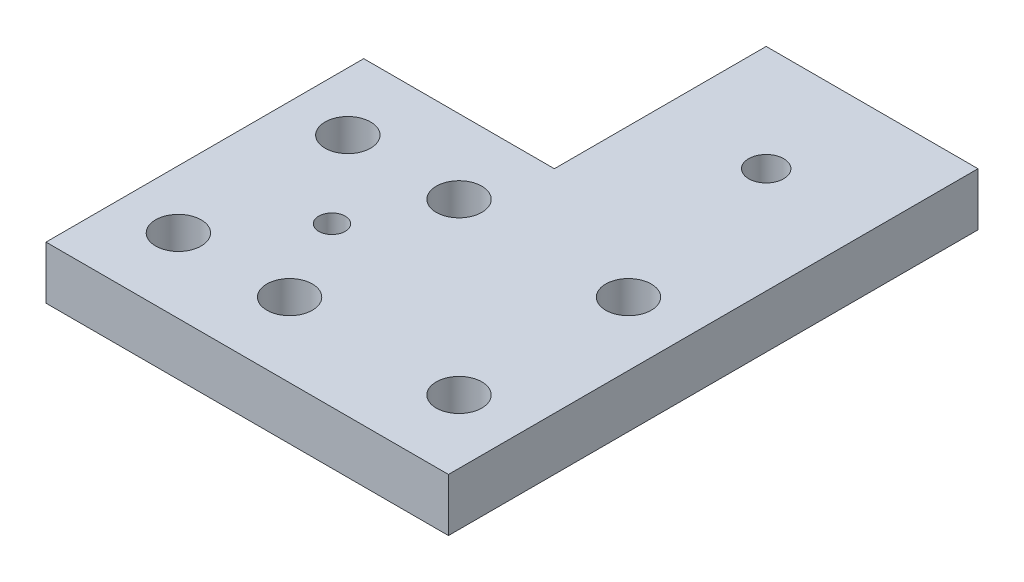
ISO-10303-21;
HEADER;
FILE_DESCRIPTION(('STEP AP214'),'2;1');
FILE_NAME('part.step','',(''),(''),'','','');
FILE_SCHEMA(('AUTOMOTIVE_DESIGN { 1 0 10303 214 1 1 1 1 }'));
ENDSEC;
DATA;
#1=APPLICATION_CONTEXT('core data for automotive mechanical design processes');
#2=APPLICATION_PROTOCOL_DEFINITION('international standard','automotive_design',2000,#1);
#3=PRODUCT_CONTEXT('',#1,'mechanical');
#4=PRODUCT('Part','Part','',(#3));
#5=PRODUCT_RELATED_PRODUCT_CATEGORY('part','',(#4));
#6=PRODUCT_DEFINITION_FORMATION('','',#4);
#7=PRODUCT_DEFINITION_CONTEXT('part definition',#1,'design');
#8=PRODUCT_DEFINITION('design','',#6,#7);
#9=PRODUCT_DEFINITION_SHAPE('','',#8);
#10=(LENGTH_UNIT() NAMED_UNIT(*) SI_UNIT(.MILLI.,.METRE.));
#11=(NAMED_UNIT(*) PLANE_ANGLE_UNIT() SI_UNIT($,.RADIAN.));
#12=(NAMED_UNIT(*) SI_UNIT($,.STERADIAN.) SOLID_ANGLE_UNIT());
#13=UNCERTAINTY_MEASURE_WITH_UNIT(LENGTH_MEASURE(1.E-05),#10,'distance_accuracy_value','');
#14=(GEOMETRIC_REPRESENTATION_CONTEXT(3) GLOBAL_UNCERTAINTY_ASSIGNED_CONTEXT((#13)) GLOBAL_UNIT_ASSIGNED_CONTEXT((#10,
#11,#12)) REPRESENTATION_CONTEXT('',''));
#15=CARTESIAN_POINT('',(0.,0.,0.));
#16=DIRECTION('',(0.,0.,1.));
#17=DIRECTION('',(1.,0.,0.));
#18=AXIS2_PLACEMENT_3D('',#15,#16,#17);
#19=CARTESIAN_POINT('',(0.,5.,0.));
#20=DIRECTION('',(0.,-1.,0.));
#21=DIRECTION('',(0.,0.,-1.));
#22=AXIS2_PLACEMENT_3D('',#19,#20,#21);
#23=PLANE('',#22);
#24=CARTESIAN_POINT('',(3.,5.,0.));
#25=DIRECTION('',(0.,1.,0.));
#26=DIRECTION('',(0.,0.,1.));
#27=AXIS2_PLACEMENT_3D('',#24,#25,#26);
#28=CIRCLE('',#27,1.24999999999999);
#29=CARTESIAN_POINT('',(3.,5.,1.24999999999999));
#30=VERTEX_POINT('',#29);
#31=EDGE_CURVE('E191',#30,#30,#28,.T.);
#32=ORIENTED_EDGE('',*,*,#31,.F.);
#33=EDGE_LOOP('',(#32));
#34=FACE_BOUND('',#33,.T.);
#35=CARTESIAN_POINT('',(19.,5.,-25.));
#36=DIRECTION('',(0.,1.,0.));
#37=DIRECTION('',(0.,0.,1.));
#38=AXIS2_PLACEMENT_3D('',#35,#36,#37);
#39=CIRCLE('',#38,1.64999999999999);
#40=CARTESIAN_POINT('',(19.,5.,-23.35));
#41=VERTEX_POINT('',#40);
#42=EDGE_CURVE('E185',#41,#41,#39,.T.);
#43=ORIENTED_EDGE('',*,*,#42,.F.);
#44=EDGE_LOOP('',(#43));
#45=FACE_BOUND('',#44,.T.);
#46=CARTESIAN_POINT('',(-3.50000000000001,5.,8.));
#47=DIRECTION('',(0.,1.,0.));
#48=DIRECTION('',(0.,0.,1.));
#49=AXIS2_PLACEMENT_3D('',#46,#47,#48);
#50=CIRCLE('',#49,2.15);
#51=CARTESIAN_POINT('',(-3.50000000000001,5.,10.15));
#52=VERTEX_POINT('',#51);
#53=EDGE_CURVE('E173',#52,#52,#50,.T.);
#54=ORIENTED_EDGE('',*,*,#53,.F.);
#55=EDGE_LOOP('',(#54));
#56=FACE_BOUND('',#55,.T.);
#57=CARTESIAN_POINT('',(23.,5.,-8.));
#58=DIRECTION('',(0.,1.,0.));
#59=DIRECTION('',(0.,0.,1.));
#60=AXIS2_PLACEMENT_3D('',#57,#58,#59);
#61=CIRCLE('',#60,2.15);
#62=CARTESIAN_POINT('',(23.,5.,-5.85));
#63=VERTEX_POINT('',#62);
#64=EDGE_CURVE('E161',#63,#63,#61,.T.);
#65=ORIENTED_EDGE('',*,*,#64,.F.);
#66=EDGE_LOOP('',(#65));
#67=FACE_BOUND('',#66,.T.);
#68=CARTESIAN_POINT('',(6.99999999999999,5.,8.));
#69=DIRECTION('',(0.,1.,0.));
#70=DIRECTION('',(0.,0.,1.));
#71=AXIS2_PLACEMENT_3D('',#68,#69,#70);
#72=CIRCLE('',#71,2.15);
#73=CARTESIAN_POINT('',(6.99999999999999,5.,10.15));
#74=VERTEX_POINT('',#73);
#75=EDGE_CURVE('E155',#74,#74,#72,.T.);
#76=ORIENTED_EDGE('',*,*,#75,.F.);
#77=EDGE_LOOP('',(#76));
#78=FACE_BOUND('',#77,.T.);
#79=CARTESIAN_POINT('',(23.,5.,8.));
#80=DIRECTION('',(0.,1.,0.));
#81=DIRECTION('',(0.,0.,1.));
#82=AXIS2_PLACEMENT_3D('',#79,#80,#81);
#83=CIRCLE('',#82,2.15);
#84=CARTESIAN_POINT('',(23.,5.,10.15));
#85=VERTEX_POINT('',#84);
#86=EDGE_CURVE('E149',#85,#85,#83,.T.);
#87=ORIENTED_EDGE('',*,*,#86,.F.);
#88=EDGE_LOOP('',(#87));
#89=FACE_BOUND('',#88,.T.);
#90=DIRECTION('',(1.,0.,0.));
#91=VECTOR('',#90,1.);
#92=CARTESIAN_POINT('',(-9.,5.,-15.));
#93=LINE('',#92,#91);
#94=CARTESIAN_POINT('',(-9.,5.,-15.));
#95=VERTEX_POINT('',#94);
#96=CARTESIAN_POINT('',(9.,5.,-15.));
#97=VERTEX_POINT('',#96);
#98=EDGE_CURVE('E133',#95,#97,#93,.T.);
#99=ORIENTED_EDGE('',*,*,#98,.F.);
#100=DIRECTION('',(0.,0.,1.));
#101=VECTOR('',#100,1.);
#102=CARTESIAN_POINT('',(-9.,5.,-15.));
#103=LINE('',#102,#101);
#104=CARTESIAN_POINT('',(-9.,5.,15.));
#105=VERTEX_POINT('',#104);
#106=EDGE_CURVE('E99',#95,#105,#103,.T.);
#107=ORIENTED_EDGE('',*,*,#106,.T.);
#108=DIRECTION('',(1.,0.,0.));
#109=VECTOR('',#108,1.);
#110=CARTESIAN_POINT('',(-9.,5.,15.));
#111=LINE('',#110,#109);
#112=CARTESIAN_POINT('',(29.,5.,15.));
#113=VERTEX_POINT('',#112);
#114=EDGE_CURVE('E93',#105,#113,#111,.T.);
#115=ORIENTED_EDGE('',*,*,#114,.T.);
#116=DIRECTION('',(0.,0.,-1.));
#117=VECTOR('',#116,1.);
#118=CARTESIAN_POINT('',(29.,5.,15.));
#119=LINE('',#118,#117);
#120=CARTESIAN_POINT('',(29.,5.,-35.));
#121=VERTEX_POINT('',#120);
#122=EDGE_CURVE('E97',#113,#121,#119,.T.);
#123=ORIENTED_EDGE('',*,*,#122,.T.);
#124=DIRECTION('',(1.,0.,0.));
#125=VECTOR('',#124,1.);
#126=CARTESIAN_POINT('',(8.99999999999999,5.,-35.));
#127=LINE('',#126,#125);
#128=CARTESIAN_POINT('',(8.99999999999999,5.,-35.));
#129=VERTEX_POINT('',#128);
#130=EDGE_CURVE('E114',#129,#121,#127,.T.);
#131=ORIENTED_EDGE('',*,*,#130,.F.);
#132=DIRECTION('',(0.,0.,1.));
#133=VECTOR('',#132,1.);
#134=CARTESIAN_POINT('',(8.99999999999999,5.,-35.));
#135=LINE('',#134,#133);
#136=EDGE_CURVE('E84',#129,#97,#135,.T.);
#137=ORIENTED_EDGE('',*,*,#136,.T.);
#138=EDGE_LOOP('',(#99,#107,#115,#123,#131,#137));
#139=FACE_BOUND('',#138,.T.);
#140=CARTESIAN_POINT('',(6.99999999999999,5.,-8.));
#141=DIRECTION('',(0.,1.,0.));
#142=DIRECTION('',(0.,0.,1.));
#143=AXIS2_PLACEMENT_3D('',#140,#141,#142);
#144=CIRCLE('',#143,2.15);
#145=CARTESIAN_POINT('',(6.99999999999999,5.,-5.85));
#146=VERTEX_POINT('',#145);
#147=EDGE_CURVE('E167',#146,#146,#144,.T.);
#148=ORIENTED_EDGE('',*,*,#147,.F.);
#149=EDGE_LOOP('',(#148));
#150=FACE_BOUND('',#149,.T.);
#151=CARTESIAN_POINT('',(-3.50000000000001,5.,-8.));
#152=DIRECTION('',(0.,1.,0.));
#153=DIRECTION('',(0.,0.,1.));
#154=AXIS2_PLACEMENT_3D('',#151,#152,#153);
#155=CIRCLE('',#154,2.15);
#156=CARTESIAN_POINT('',(-3.50000000000001,5.,-5.85));
#157=VERTEX_POINT('',#156);
#158=EDGE_CURVE('E179',#157,#157,#155,.T.);
#159=ORIENTED_EDGE('',*,*,#158,.F.);
#160=EDGE_LOOP('',(#159));
#161=FACE_BOUND('',#160,.T.);
#162=ADVANCED_FACE('F34',(#34,#45,#56,#67,#78,#89,#139,#150,#161),#23,.F.);
#163=CARTESIAN_POINT('',(-9.,5.,-15.));
#164=DIRECTION('',(0.,0.,-1.));
#165=DIRECTION('',(-1.,0.,0.));
#166=AXIS2_PLACEMENT_3D('',#163,#164,#165);
#167=PLANE('',#166);
#168=DIRECTION('',(1.,0.,0.));
#169=VECTOR('',#168,1.);
#170=CARTESIAN_POINT('',(-9.,0.,-15.));
#171=LINE('',#170,#169);
#172=CARTESIAN_POINT('',(-9.,0.,-15.));
#173=VERTEX_POINT('',#172);
#174=CARTESIAN_POINT('',(9.,0.,-15.));
#175=VERTEX_POINT('',#174);
#176=EDGE_CURVE('E120',#173,#175,#171,.T.);
#177=ORIENTED_EDGE('',*,*,#176,.F.);
#178=DIRECTION('',(0.,-1.,0.));
#179=VECTOR('',#178,1.);
#180=CARTESIAN_POINT('',(-9.,5.,-15.));
#181=LINE('',#180,#179);
#182=EDGE_CURVE('E11',#95,#173,#181,.T.);
#183=ORIENTED_EDGE('',*,*,#182,.F.);
#184=ORIENTED_EDGE('',*,*,#98,.T.);
#185=DIRECTION('',(0.,-1.,0.));
#186=VECTOR('',#185,1.);
#187=CARTESIAN_POINT('',(9.,5.,-15.));
#188=LINE('',#187,#186);
#189=EDGE_CURVE('E38',#97,#175,#188,.T.);
#190=ORIENTED_EDGE('',*,*,#189,.T.);
#191=EDGE_LOOP('',(#177,#183,#184,#190));
#192=FACE_BOUND('',#191,.T.);
#193=ADVANCED_FACE('F36',(#192),#167,.T.);
#194=CARTESIAN_POINT('',(-9.,5.,-15.));
#195=DIRECTION('',(1.,0.,0.));
#196=DIRECTION('',(0.,0.,-1.));
#197=AXIS2_PLACEMENT_3D('',#194,#195,#196);
#198=PLANE('',#197);
#199=DIRECTION('',(0.,0.,1.));
#200=VECTOR('',#199,1.);
#201=CARTESIAN_POINT('',(-9.,0.,-15.));
#202=LINE('',#201,#200);
#203=CARTESIAN_POINT('',(-9.,0.,15.));
#204=VERTEX_POINT('',#203);
#205=EDGE_CURVE('E74',#173,#204,#202,.T.);
#206=ORIENTED_EDGE('',*,*,#205,.T.);
#207=DIRECTION('',(0.,-1.,0.));
#208=VECTOR('',#207,1.);
#209=CARTESIAN_POINT('',(-9.,5.,15.));
#210=LINE('',#209,#208);
#211=EDGE_CURVE('E44',#105,#204,#210,.T.);
#212=ORIENTED_EDGE('',*,*,#211,.F.);
#213=ORIENTED_EDGE('',*,*,#106,.F.);
#214=ORIENTED_EDGE('',*,*,#182,.T.);
#215=EDGE_LOOP('',(#206,#212,#213,#214));
#216=FACE_BOUND('',#215,.T.);
#217=ADVANCED_FACE('F227',(#216),#198,.F.);
#218=CARTESIAN_POINT('',(-9.,5.,15.));
#219=DIRECTION('',(0.,0.,-1.));
#220=DIRECTION('',(-1.,0.,0.));
#221=AXIS2_PLACEMENT_3D('',#218,#219,#220);
#222=PLANE('',#221);
#223=DIRECTION('',(1.,0.,0.));
#224=VECTOR('',#223,1.);
#225=CARTESIAN_POINT('',(-9.,0.,15.));
#226=LINE('',#225,#224);
#227=CARTESIAN_POINT('',(29.,0.,15.));
#228=VERTEX_POINT('',#227);
#229=EDGE_CURVE('E106',#204,#228,#226,.T.);
#230=ORIENTED_EDGE('',*,*,#229,.T.);
#231=DIRECTION('',(0.,-1.,0.));
#232=VECTOR('',#231,1.);
#233=CARTESIAN_POINT('',(29.,5.,15.));
#234=LINE('',#233,#232);
#235=EDGE_CURVE('E103',#113,#228,#234,.T.);
#236=ORIENTED_EDGE('',*,*,#235,.F.);
#237=ORIENTED_EDGE('',*,*,#114,.F.);
#238=ORIENTED_EDGE('',*,*,#211,.T.);
#239=EDGE_LOOP('',(#230,#236,#237,#238));
#240=FACE_BOUND('',#239,.T.);
#241=ADVANCED_FACE('F104',(#240),#222,.F.);
#242=CARTESIAN_POINT('',(29.,5.,15.));
#243=DIRECTION('',(-1.,0.,0.));
#244=DIRECTION('',(0.,0.,1.));
#245=AXIS2_PLACEMENT_3D('',#242,#243,#244);
#246=PLANE('',#245);
#247=DIRECTION('',(0.,0.,-1.));
#248=VECTOR('',#247,1.);
#249=CARTESIAN_POINT('',(29.,0.,15.));
#250=LINE('',#249,#248);
#251=CARTESIAN_POINT('',(29.,0.,-35.));
#252=VERTEX_POINT('',#251);
#253=EDGE_CURVE('E130',#228,#252,#250,.T.);
#254=ORIENTED_EDGE('',*,*,#253,.T.);
#255=DIRECTION('',(0.,-1.,0.));
#256=VECTOR('',#255,1.);
#257=CARTESIAN_POINT('',(29.,5.,-35.));
#258=LINE('',#257,#256);
#259=EDGE_CURVE('E110',#121,#252,#258,.T.);
#260=ORIENTED_EDGE('',*,*,#259,.F.);
#261=ORIENTED_EDGE('',*,*,#122,.F.);
#262=ORIENTED_EDGE('',*,*,#235,.T.);
#263=EDGE_LOOP('',(#254,#260,#261,#262));
#264=FACE_BOUND('',#263,.T.);
#265=ADVANCED_FACE('F112',(#264),#246,.F.);
#266=CARTESIAN_POINT('',(8.99999999999999,5.,-35.));
#267=DIRECTION('',(0.,0.,-1.));
#268=DIRECTION('',(-1.,0.,0.));
#269=AXIS2_PLACEMENT_3D('',#266,#267,#268);
#270=PLANE('',#269);
#271=DIRECTION('',(1.,0.,0.));
#272=VECTOR('',#271,1.);
#273=CARTESIAN_POINT('',(8.99999999999999,0.,-35.));
#274=LINE('',#273,#272);
#275=CARTESIAN_POINT('',(8.99999999999999,0.,-35.));
#276=VERTEX_POINT('',#275);
#277=EDGE_CURVE('E127',#276,#252,#274,.T.);
#278=ORIENTED_EDGE('',*,*,#277,.F.);
#279=DIRECTION('',(0.,-1.,0.));
#280=VECTOR('',#279,1.);
#281=CARTESIAN_POINT('',(8.99999999999999,5.,-35.));
#282=LINE('',#281,#280);
#283=EDGE_CURVE('E136',#129,#276,#282,.T.);
#284=ORIENTED_EDGE('',*,*,#283,.F.);
#285=ORIENTED_EDGE('',*,*,#130,.T.);
#286=ORIENTED_EDGE('',*,*,#259,.T.);
#287=EDGE_LOOP('',(#278,#284,#285,#286));
#288=FACE_BOUND('',#287,.T.);
#289=ADVANCED_FACE('F144',(#288),#270,.T.);
#290=CARTESIAN_POINT('',(8.99999999999999,5.,-35.));
#291=DIRECTION('',(1.,0.,0.));
#292=DIRECTION('',(0.,0.,-1.));
#293=AXIS2_PLACEMENT_3D('',#290,#291,#292);
#294=PLANE('',#293);
#295=DIRECTION('',(0.,0.,1.));
#296=VECTOR('',#295,1.);
#297=CARTESIAN_POINT('',(8.99999999999999,0.,-35.));
#298=LINE('',#297,#296);
#299=EDGE_CURVE('E123',#276,#175,#298,.T.);
#300=ORIENTED_EDGE('',*,*,#299,.T.);
#301=ORIENTED_EDGE('',*,*,#189,.F.);
#302=ORIENTED_EDGE('',*,*,#136,.F.);
#303=ORIENTED_EDGE('',*,*,#283,.T.);
#304=EDGE_LOOP('',(#300,#301,#302,#303));
#305=FACE_BOUND('',#304,.T.);
#306=ADVANCED_FACE('F139',(#305),#294,.F.);
#307=CARTESIAN_POINT('',(0.,0.,0.));
#308=DIRECTION('',(0.,-1.,0.));
#309=DIRECTION('',(0.,0.,-1.));
#310=AXIS2_PLACEMENT_3D('',#307,#308,#309);
#311=PLANE('',#310);
#312=CARTESIAN_POINT('',(3.,0.,0.));
#313=DIRECTION('',(0.,-1.,0.));
#314=DIRECTION('',(0.,0.,-1.));
#315=AXIS2_PLACEMENT_3D('',#312,#313,#314);
#316=CIRCLE('',#315,1.25);
#317=CARTESIAN_POINT('',(3.,0.,-1.25));
#318=VERTEX_POINT('',#317);
#319=EDGE_CURVE('E188',#318,#318,#316,.T.);
#320=ORIENTED_EDGE('',*,*,#319,.F.);
#321=EDGE_LOOP('',(#320));
#322=FACE_BOUND('',#321,.T.);
#323=CARTESIAN_POINT('',(19.,0.,-25.));
#324=DIRECTION('',(0.,1.,0.));
#325=DIRECTION('',(0.,0.,1.));
#326=AXIS2_PLACEMENT_3D('',#323,#324,#325);
#327=CIRCLE('',#326,1.65);
#328=CARTESIAN_POINT('',(19.,0.,-23.35));
#329=VERTEX_POINT('',#328);
#330=EDGE_CURVE('E182',#329,#329,#327,.T.);
#331=ORIENTED_EDGE('',*,*,#330,.T.);
#332=EDGE_LOOP('',(#331));
#333=FACE_BOUND('',#332,.T.);
#334=CARTESIAN_POINT('',(-3.50000000000001,0.,-8.));
#335=DIRECTION('',(0.,-1.,0.));
#336=DIRECTION('',(0.,0.,-1.));
#337=AXIS2_PLACEMENT_3D('',#334,#335,#336);
#338=CIRCLE('',#337,2.15);
#339=CARTESIAN_POINT('',(-3.50000000000001,0.,-10.15));
#340=VERTEX_POINT('',#339);
#341=EDGE_CURVE('E176',#340,#340,#338,.T.);
#342=ORIENTED_EDGE('',*,*,#341,.F.);
#343=EDGE_LOOP('',(#342));
#344=FACE_BOUND('',#343,.T.);
#345=CARTESIAN_POINT('',(-3.50000000000001,0.,8.));
#346=DIRECTION('',(0.,-1.,0.));
#347=DIRECTION('',(0.,0.,-1.));
#348=AXIS2_PLACEMENT_3D('',#345,#346,#347);
#349=CIRCLE('',#348,2.15);
#350=CARTESIAN_POINT('',(-3.50000000000001,0.,5.85));
#351=VERTEX_POINT('',#350);
#352=EDGE_CURVE('E170',#351,#351,#349,.T.);
#353=ORIENTED_EDGE('',*,*,#352,.F.);
#354=EDGE_LOOP('',(#353));
#355=FACE_BOUND('',#354,.T.);
#356=CARTESIAN_POINT('',(6.99999999999999,0.,-8.));
#357=DIRECTION('',(0.,-1.,0.));
#358=DIRECTION('',(0.,0.,-1.));
#359=AXIS2_PLACEMENT_3D('',#356,#357,#358);
#360=CIRCLE('',#359,2.15);
#361=CARTESIAN_POINT('',(6.99999999999999,0.,-10.15));
#362=VERTEX_POINT('',#361);
#363=EDGE_CURVE('E164',#362,#362,#360,.T.);
#364=ORIENTED_EDGE('',*,*,#363,.F.);
#365=EDGE_LOOP('',(#364));
#366=FACE_BOUND('',#365,.T.);
#367=CARTESIAN_POINT('',(23.,0.,-8.));
#368=DIRECTION('',(0.,-1.,0.));
#369=DIRECTION('',(0.,0.,-1.));
#370=AXIS2_PLACEMENT_3D('',#367,#368,#369);
#371=CIRCLE('',#370,2.15);
#372=CARTESIAN_POINT('',(23.,0.,-10.15));
#373=VERTEX_POINT('',#372);
#374=EDGE_CURVE('E158',#373,#373,#371,.T.);
#375=ORIENTED_EDGE('',*,*,#374,.F.);
#376=EDGE_LOOP('',(#375));
#377=FACE_BOUND('',#376,.T.);
#378=CARTESIAN_POINT('',(6.99999999999999,0.,8.));
#379=DIRECTION('',(0.,-1.,0.));
#380=DIRECTION('',(0.,0.,-1.));
#381=AXIS2_PLACEMENT_3D('',#378,#379,#380);
#382=CIRCLE('',#381,2.15);
#383=CARTESIAN_POINT('',(6.99999999999999,0.,5.85));
#384=VERTEX_POINT('',#383);
#385=EDGE_CURVE('E152',#384,#384,#382,.T.);
#386=ORIENTED_EDGE('',*,*,#385,.F.);
#387=EDGE_LOOP('',(#386));
#388=FACE_BOUND('',#387,.T.);
#389=CARTESIAN_POINT('',(23.,0.,8.));
#390=DIRECTION('',(0.,-1.,0.));
#391=DIRECTION('',(0.,0.,-1.));
#392=AXIS2_PLACEMENT_3D('',#389,#390,#391);
#393=CIRCLE('',#392,2.15);
#394=CARTESIAN_POINT('',(23.,0.,5.85));
#395=VERTEX_POINT('',#394);
#396=EDGE_CURVE('E124',#395,#395,#393,.T.);
#397=ORIENTED_EDGE('',*,*,#396,.F.);
#398=EDGE_LOOP('',(#397));
#399=FACE_BOUND('',#398,.T.);
#400=ORIENTED_EDGE('',*,*,#176,.T.);
#401=ORIENTED_EDGE('',*,*,#299,.F.);
#402=ORIENTED_EDGE('',*,*,#277,.T.);
#403=ORIENTED_EDGE('',*,*,#253,.F.);
#404=ORIENTED_EDGE('',*,*,#229,.F.);
#405=ORIENTED_EDGE('',*,*,#205,.F.);
#406=EDGE_LOOP('',(#400,#401,#402,#403,#404,#405));
#407=FACE_BOUND('',#406,.T.);
#408=ADVANCED_FACE('F142',(#322,#333,#344,#355,#366,#377,#388,#399,#407),#311,.T.);
#409=CARTESIAN_POINT('',(23.,5.,8.));
#410=DIRECTION('',(0.,1.,0.));
#411=DIRECTION('',(0.,0.,1.));
#412=AXIS2_PLACEMENT_3D('',#409,#410,#411);
#413=CYLINDRICAL_SURFACE('',#412,2.15);
#414=ORIENTED_EDGE('',*,*,#86,.T.);
#415=EDGE_LOOP('',(#414));
#416=FACE_BOUND('',#415,.T.);
#417=ORIENTED_EDGE('',*,*,#396,.T.);
#418=EDGE_LOOP('',(#417));
#419=FACE_BOUND('',#418,.T.);
#420=ADVANCED_FACE('F211',(#416,#419),#413,.F.);
#421=CARTESIAN_POINT('',(6.99999999999999,5.,8.));
#422=DIRECTION('',(0.,1.,0.));
#423=DIRECTION('',(0.,0.,1.));
#424=AXIS2_PLACEMENT_3D('',#421,#422,#423);
#425=CYLINDRICAL_SURFACE('',#424,2.15);
#426=ORIENTED_EDGE('',*,*,#75,.T.);
#427=EDGE_LOOP('',(#426));
#428=FACE_BOUND('',#427,.T.);
#429=ORIENTED_EDGE('',*,*,#385,.T.);
#430=EDGE_LOOP('',(#429));
#431=FACE_BOUND('',#430,.T.);
#432=ADVANCED_FACE('F214',(#428,#431),#425,.F.);
#433=CARTESIAN_POINT('',(23.,5.,-8.));
#434=DIRECTION('',(0.,1.,0.));
#435=DIRECTION('',(0.,0.,1.));
#436=AXIS2_PLACEMENT_3D('',#433,#434,#435);
#437=CYLINDRICAL_SURFACE('',#436,2.15);
#438=ORIENTED_EDGE('',*,*,#64,.T.);
#439=EDGE_LOOP('',(#438));
#440=FACE_BOUND('',#439,.T.);
#441=ORIENTED_EDGE('',*,*,#374,.T.);
#442=EDGE_LOOP('',(#441));
#443=FACE_BOUND('',#442,.T.);
#444=ADVANCED_FACE('F259',(#440,#443),#437,.F.);
#445=CARTESIAN_POINT('',(6.99999999999999,5.,-8.));
#446=DIRECTION('',(0.,1.,0.));
#447=DIRECTION('',(0.,0.,1.));
#448=AXIS2_PLACEMENT_3D('',#445,#446,#447);
#449=CYLINDRICAL_SURFACE('',#448,2.15);
#450=ORIENTED_EDGE('',*,*,#147,.T.);
#451=EDGE_LOOP('',(#450));
#452=FACE_BOUND('',#451,.T.);
#453=ORIENTED_EDGE('',*,*,#363,.T.);
#454=EDGE_LOOP('',(#453));
#455=FACE_BOUND('',#454,.T.);
#456=ADVANCED_FACE('F269',(#452,#455),#449,.F.);
#457=CARTESIAN_POINT('',(-3.50000000000001,5.,8.));
#458=DIRECTION('',(0.,1.,0.));
#459=DIRECTION('',(0.,0.,1.));
#460=AXIS2_PLACEMENT_3D('',#457,#458,#459);
#461=CYLINDRICAL_SURFACE('',#460,2.15);
#462=ORIENTED_EDGE('',*,*,#53,.T.);
#463=EDGE_LOOP('',(#462));
#464=FACE_BOUND('',#463,.T.);
#465=ORIENTED_EDGE('',*,*,#352,.T.);
#466=EDGE_LOOP('',(#465));
#467=FACE_BOUND('',#466,.T.);
#468=ADVANCED_FACE('F279',(#464,#467),#461,.F.);
#469=CARTESIAN_POINT('',(-3.50000000000001,5.,-8.));
#470=DIRECTION('',(0.,1.,0.));
#471=DIRECTION('',(0.,0.,1.));
#472=AXIS2_PLACEMENT_3D('',#469,#470,#471);
#473=CYLINDRICAL_SURFACE('',#472,2.15);
#474=ORIENTED_EDGE('',*,*,#158,.T.);
#475=EDGE_LOOP('',(#474));
#476=FACE_BOUND('',#475,.T.);
#477=ORIENTED_EDGE('',*,*,#341,.T.);
#478=EDGE_LOOP('',(#477));
#479=FACE_BOUND('',#478,.T.);
#480=ADVANCED_FACE('F290',(#476,#479),#473,.F.);
#481=CARTESIAN_POINT('',(19.,5.,-25.));
#482=DIRECTION('',(0.,1.,0.));
#483=DIRECTION('',(0.,0.,1.));
#484=AXIS2_PLACEMENT_3D('',#481,#482,#483);
#485=CYLINDRICAL_SURFACE('',#484,1.64999999999999);
#486=ORIENTED_EDGE('',*,*,#330,.F.);
#487=EDGE_LOOP('',(#486));
#488=FACE_BOUND('',#487,.T.);
#489=ORIENTED_EDGE('',*,*,#42,.T.);
#490=EDGE_LOOP('',(#489));
#491=FACE_BOUND('',#490,.T.);
#492=ADVANCED_FACE('F300',(#488,#491),#485,.F.);
#493=CARTESIAN_POINT('',(3.,5.,0.));
#494=DIRECTION('',(0.,1.,0.));
#495=DIRECTION('',(0.,0.,1.));
#496=AXIS2_PLACEMENT_3D('',#493,#494,#495);
#497=CYLINDRICAL_SURFACE('',#496,1.25);
#498=ORIENTED_EDGE('',*,*,#31,.T.);
#499=EDGE_LOOP('',(#498));
#500=FACE_BOUND('',#499,.T.);
#501=ORIENTED_EDGE('',*,*,#319,.T.);
#502=EDGE_LOOP('',(#501));
#503=FACE_BOUND('',#502,.T.);
#504=ADVANCED_FACE('F195',(#500,#503),#497,.F.);
#505=CLOSED_SHELL('',(#162,#193,#217,#241,#265,#289,#306,#408,#420,#432,#444,#456,#468,#480,
#492,#504));
#506=MANIFOLD_SOLID_BREP('B2',#505);
#507=ADVANCED_BREP_SHAPE_REPRESENTATION('',(#18,#506),#14);
#508=SHAPE_DEFINITION_REPRESENTATION(#9,#507);
ENDSEC;
END-ISO-10303-21;
